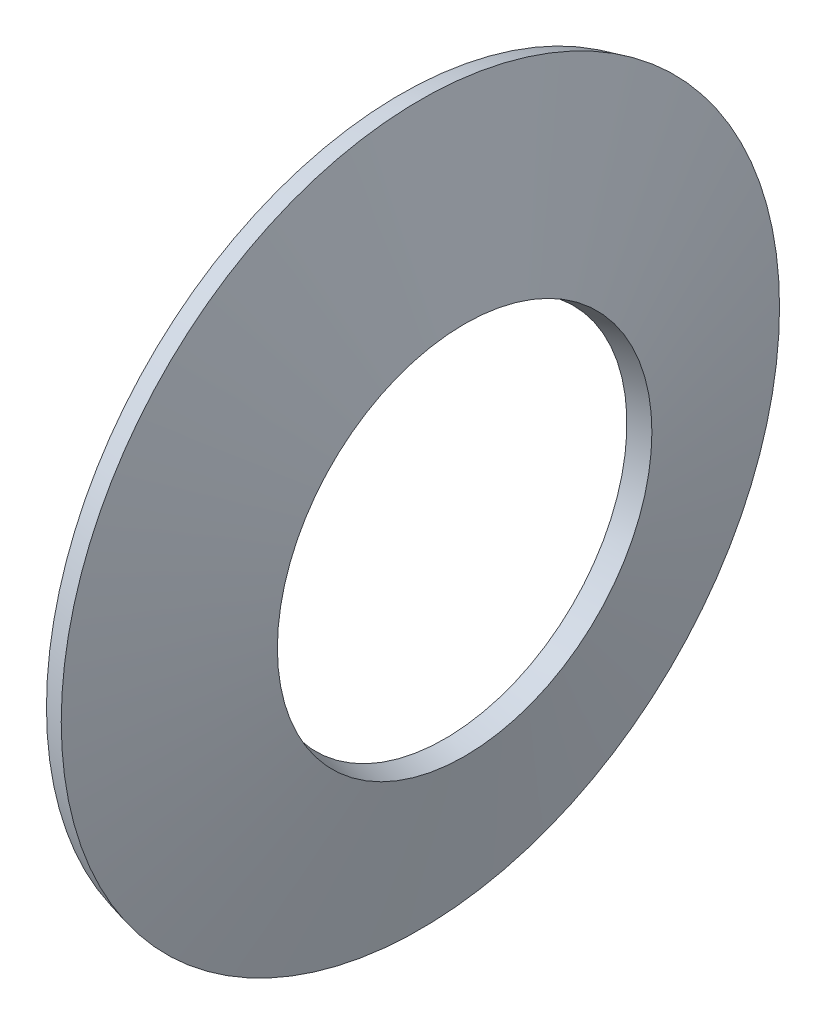
ISO-10303-21;
HEADER;
FILE_DESCRIPTION(('STEP AP214'),'2;1');
FILE_NAME('part.step','',(''),(''),'','','');
FILE_SCHEMA(('AUTOMOTIVE_DESIGN { 1 0 10303 214 1 1 1 1 }'));
ENDSEC;
DATA;
#1=APPLICATION_CONTEXT('core data for automotive mechanical design processes');
#2=APPLICATION_PROTOCOL_DEFINITION('international standard','automotive_design',2000,#1);
#3=PRODUCT_CONTEXT('',#1,'mechanical');
#4=PRODUCT('Part','Part','',(#3));
#5=PRODUCT_RELATED_PRODUCT_CATEGORY('part','',(#4));
#6=PRODUCT_DEFINITION_FORMATION('','',#4);
#7=PRODUCT_DEFINITION_CONTEXT('part definition',#1,'design');
#8=PRODUCT_DEFINITION('design','',#6,#7);
#9=PRODUCT_DEFINITION_SHAPE('','',#8);
#10=(LENGTH_UNIT() NAMED_UNIT(*) SI_UNIT(.MILLI.,.METRE.));
#11=(NAMED_UNIT(*) PLANE_ANGLE_UNIT() SI_UNIT($,.RADIAN.));
#12=(NAMED_UNIT(*) SI_UNIT($,.STERADIAN.) SOLID_ANGLE_UNIT());
#13=UNCERTAINTY_MEASURE_WITH_UNIT(LENGTH_MEASURE(1.E-05),#10,'distance_accuracy_value','');
#14=(GEOMETRIC_REPRESENTATION_CONTEXT(3) GLOBAL_UNCERTAINTY_ASSIGNED_CONTEXT((#13)) GLOBAL_UNIT_ASSIGNED_CONTEXT((#10,
#11,#12)) REPRESENTATION_CONTEXT('',''));
#15=CARTESIAN_POINT('',(0.,0.,0.));
#16=DIRECTION('',(0.,0.,1.));
#17=DIRECTION('',(1.,0.,0.));
#18=AXIS2_PLACEMENT_3D('',#15,#16,#17);
#19=CARTESIAN_POINT('',(0.,0.,0.));
#20=DIRECTION('',(-1.,0.,0.));
#21=DIRECTION('',(0.,0.,1.));
#22=AXIS2_PLACEMENT_3D('',#19,#20,#21);
#23=CONICAL_SURFACE('',#22,13.8005200878927,1.31878744409519);
#24=CARTESIAN_POINT('',(1.72526923085134,0.,0.));
#25=DIRECTION('',(-1.,0.,0.));
#26=DIRECTION('',(0.,0.,1.));
#27=AXIS2_PLACEMENT_3D('',#24,#25,#26);
#28=CIRCLE('',#27,7.1);
#29=CARTESIAN_POINT('',(1.72526923085134,0.,7.1));
#30=VERTEX_POINT('',#29);
#31=EDGE_CURVE('E10',#30,#30,#28,.T.);
#32=ORIENTED_EDGE('',*,*,#31,.F.);
#33=EDGE_LOOP('',(#32));
#34=FACE_BOUND('',#33,.T.);
#35=CARTESIAN_POINT('',(0.,0.,0.));
#36=DIRECTION('',(-1.,0.,0.));
#37=DIRECTION('',(0.,0.,1.));
#38=AXIS2_PLACEMENT_3D('',#35,#36,#37);
#39=CIRCLE('',#38,13.8005200878927);
#40=CARTESIAN_POINT('',(0.,0.,13.8005200878927));
#41=VERTEX_POINT('',#40);
#42=EDGE_CURVE('E50',#41,#41,#39,.T.);
#43=ORIENTED_EDGE('',*,*,#42,.T.);
#44=EDGE_LOOP('',(#43));
#45=FACE_BOUND('',#44,.T.);
#46=ADVANCED_FACE('F31',(#34,#45),#23,.F.);
#47=CARTESIAN_POINT('',(1.72526923085134,0.,0.));
#48=DIRECTION('',(1.,0.,0.));
#49=DIRECTION('',(0.,0.,-1.));
#50=AXIS2_PLACEMENT_3D('',#47,#48,#49);
#51=CONICAL_SURFACE('',#50,7.1,0.252008882699704);
#52=CARTESIAN_POINT('',(2.5,0.,0.));
#53=DIRECTION('',(-1.,0.,0.));
#54=DIRECTION('',(0.,0.,1.));
#55=AXIS2_PLACEMENT_3D('',#52,#53,#54);
#56=CIRCLE('',#55,7.29947991210729);
#57=CARTESIAN_POINT('',(2.5,0.,7.29947991210729));
#58=VERTEX_POINT('',#57);
#59=EDGE_CURVE('E39',#58,#58,#56,.T.);
#60=ORIENTED_EDGE('',*,*,#59,.F.);
#61=EDGE_LOOP('',(#60));
#62=FACE_BOUND('',#61,.T.);
#63=ORIENTED_EDGE('',*,*,#31,.T.);
#64=EDGE_LOOP('',(#63));
#65=FACE_BOUND('',#64,.T.);
#66=ADVANCED_FACE('F64',(#62,#65),#51,.F.);
#67=CARTESIAN_POINT('',(2.5,0.,0.));
#68=DIRECTION('',(-1.,0.,0.));
#69=DIRECTION('',(0.,0.,1.));
#70=AXIS2_PLACEMENT_3D('',#67,#68,#69);
#71=CONICAL_SURFACE('',#70,7.29947991210729,1.31878744409519);
#72=CARTESIAN_POINT('',(0.774730769148656,0.,0.));
#73=DIRECTION('',(-1.,0.,0.));
#74=DIRECTION('',(0.,0.,1.));
#75=AXIS2_PLACEMENT_3D('',#72,#73,#74);
#76=CIRCLE('',#75,14.);
#77=CARTESIAN_POINT('',(0.774730769148656,0.,14.));
#78=VERTEX_POINT('',#77);
#79=EDGE_CURVE('E43',#78,#78,#76,.T.);
#80=ORIENTED_EDGE('',*,*,#79,.F.);
#81=EDGE_LOOP('',(#80));
#82=FACE_BOUND('',#81,.T.);
#83=ORIENTED_EDGE('',*,*,#59,.T.);
#84=EDGE_LOOP('',(#83));
#85=FACE_BOUND('',#84,.T.);
#86=ADVANCED_FACE('F60',(#82,#85),#71,.T.);
#87=CARTESIAN_POINT('',(0.774730769148656,0.,0.));
#88=DIRECTION('',(1.,0.,0.));
#89=DIRECTION('',(0.,0.,-1.));
#90=AXIS2_PLACEMENT_3D('',#87,#88,#89);
#91=CONICAL_SURFACE('',#90,14.,0.252008882699706);
#92=ORIENTED_EDGE('',*,*,#42,.F.);
#93=EDGE_LOOP('',(#92));
#94=FACE_BOUND('',#93,.T.);
#95=ORIENTED_EDGE('',*,*,#79,.T.);
#96=EDGE_LOOP('',(#95));
#97=FACE_BOUND('',#96,.T.);
#98=ADVANCED_FACE('F53',(#94,#97),#91,.T.);
#99=CLOSED_SHELL('',(#46,#66,#86,#98));
#100=MANIFOLD_SOLID_BREP('B2',#99);
#101=ADVANCED_BREP_SHAPE_REPRESENTATION('',(#18,#100),#14);
#102=SHAPE_DEFINITION_REPRESENTATION(#9,#101);
ENDSEC;
END-ISO-10303-21;
